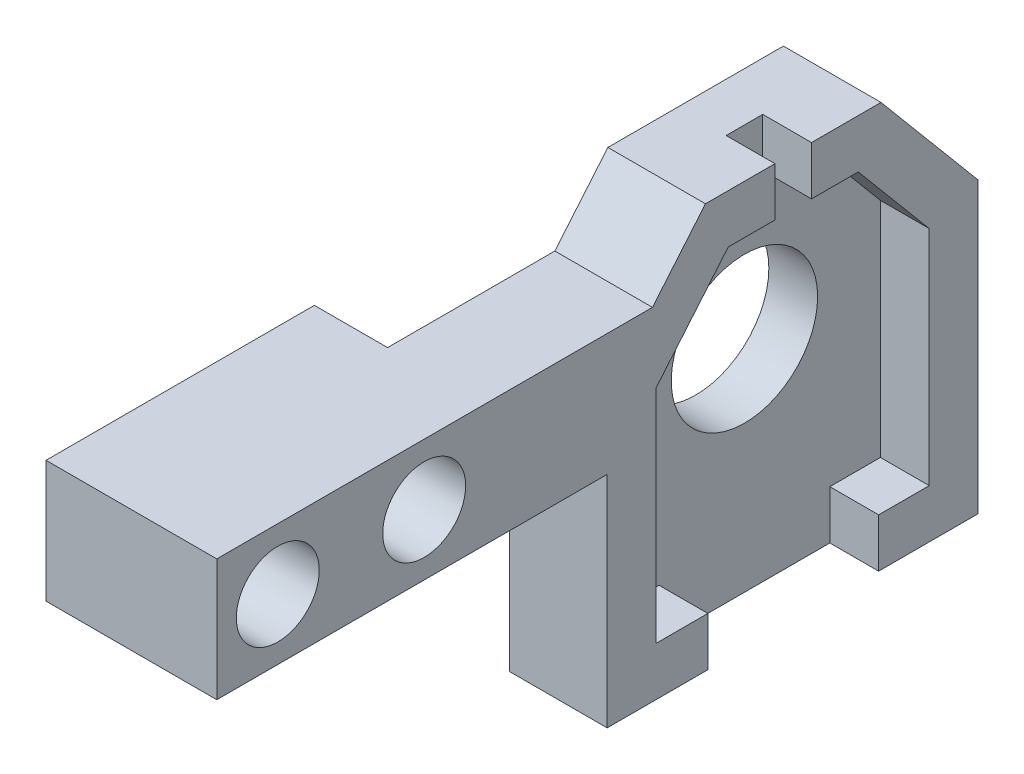
ISO-10303-21;
HEADER;
FILE_DESCRIPTION(('STEP AP214'),'2;1');
FILE_NAME('part.step','',(''),(''),'','','');
FILE_SCHEMA(('AUTOMOTIVE_DESIGN { 1 0 10303 214 1 1 1 1 }'));
ENDSEC;
DATA;
#1=APPLICATION_CONTEXT('core data for automotive mechanical design processes');
#2=APPLICATION_PROTOCOL_DEFINITION('international standard','automotive_design',2000,#1);
#3=PRODUCT_CONTEXT('',#1,'mechanical');
#4=PRODUCT('Part','Part','',(#3));
#5=PRODUCT_RELATED_PRODUCT_CATEGORY('part','',(#4));
#6=PRODUCT_DEFINITION_FORMATION('','',#4);
#7=PRODUCT_DEFINITION_CONTEXT('part definition',#1,'design');
#8=PRODUCT_DEFINITION('design','',#6,#7);
#9=PRODUCT_DEFINITION_SHAPE('','',#8);
#10=(LENGTH_UNIT() NAMED_UNIT(*) SI_UNIT(.MILLI.,.METRE.));
#11=(NAMED_UNIT(*) PLANE_ANGLE_UNIT() SI_UNIT($,.RADIAN.));
#12=(NAMED_UNIT(*) SI_UNIT($,.STERADIAN.) SOLID_ANGLE_UNIT());
#13=UNCERTAINTY_MEASURE_WITH_UNIT(LENGTH_MEASURE(1.E-05),#10,'distance_accuracy_value','');
#14=(GEOMETRIC_REPRESENTATION_CONTEXT(3) GLOBAL_UNCERTAINTY_ASSIGNED_CONTEXT((#13)) GLOBAL_UNIT_ASSIGNED_CONTEXT((#10,
#11,#12)) REPRESENTATION_CONTEXT('',''));
#15=CARTESIAN_POINT('',(0.,0.,0.));
#16=DIRECTION('',(0.,0.,1.));
#17=DIRECTION('',(1.,0.,0.));
#18=AXIS2_PLACEMENT_3D('',#15,#16,#17);
#19=CARTESIAN_POINT('',(0.,0.,0.));
#20=DIRECTION('',(-1.,0.,0.));
#21=DIRECTION('',(0.,0.,1.));
#22=AXIS2_PLACEMENT_3D('',#19,#20,#21);
#23=PLANE('',#22);
#24=CARTESIAN_POINT('',(0.,1.90865976235804,0.482116569244563));
#25=DIRECTION('',(1.,0.,0.));
#26=DIRECTION('',(0.,0.,-1.));
#27=AXIS2_PLACEMENT_3D('',#24,#25,#26);
#28=CIRCLE('',#27,3.);
#29=CARTESIAN_POINT('',(0.,1.90865976235804,-2.51788343075544));
#30=VERTEX_POINT('',#29);
#31=EDGE_CURVE('E228',#30,#30,#28,.T.);
#32=ORIENTED_EDGE('',*,*,#31,.F.);
#33=EDGE_LOOP('',(#32));
#34=FACE_BOUND('',#33,.T.);
#35=DIRECTION('',(0.,1.,0.));
#36=VECTOR('',#35,1.);
#37=CARTESIAN_POINT('',(0.,7.49865976235804,1.23211656924456));
#38=LINE('',#37,#36);
#39=CARTESIAN_POINT('',(0.,7.49865976235804,1.23211656924456));
#40=VERTEX_POINT('',#39);
#41=CARTESIAN_POINT('',(0.,9.49865976235804,1.23211656924456));
#42=VERTEX_POINT('',#41);
#43=EDGE_CURVE('E65',#40,#42,#38,.T.);
#44=ORIENTED_EDGE('',*,*,#43,.F.);
#45=DIRECTION('',(0.,0.,-1.));
#46=VECTOR('',#45,1.);
#47=CARTESIAN_POINT('',(0.,7.49865976235804,3.14728681258254));
#48=LINE('',#47,#46);
#49=CARTESIAN_POINT('',(0.,7.49865976235804,3.14728681258254));
#50=VERTEX_POINT('',#49);
#51=EDGE_CURVE('E403',#50,#40,#48,.T.);
#52=ORIENTED_EDGE('',*,*,#51,.F.);
#53=DIRECTION('',(0.,0.766044443118982,-0.642787609686534));
#54=VECTOR('',#53,1.);
#55=CARTESIAN_POINT('',(0.,3.96865976235804,6.1093085106383));
#56=LINE('',#55,#54);
#57=CARTESIAN_POINT('',(0.,3.96865976235804,6.1093085106383));
#58=VERTEX_POINT('',#57);
#59=EDGE_CURVE('E399',#58,#50,#56,.T.);
#60=ORIENTED_EDGE('',*,*,#59,.F.);
#61=DIRECTION('',(0.,1.,0.));
#62=VECTOR('',#61,1.);
#63=CARTESIAN_POINT('',(0.,3.96865976235804,6.1093085106383));
#64=LINE('',#63,#62);
#65=CARTESIAN_POINT('',(0.,-5.09134023764196,6.1093085106383));
#66=VERTEX_POINT('',#65);
#67=EDGE_CURVE('E394',#66,#58,#64,.T.);
#68=ORIENTED_EDGE('',*,*,#67,.F.);
#69=DIRECTION('',(0.,0.,1.));
#70=VECTOR('',#69,1.);
#71=CARTESIAN_POINT('',(0.,-5.09134023764196,6.1093085106383));
#72=LINE('',#71,#70);
#73=CARTESIAN_POINT('',(0.,-5.09134023764196,3.98211656924456));
#74=VERTEX_POINT('',#73);
#75=EDGE_CURVE('E390',#74,#66,#72,.T.);
#76=ORIENTED_EDGE('',*,*,#75,.F.);
#77=DIRECTION('',(0.,1.,0.));
#78=VECTOR('',#77,1.);
#79=CARTESIAN_POINT('',(0.,-5.09134023764196,3.98211656924456));
#80=LINE('',#79,#78);
#81=CARTESIAN_POINT('',(0.,-7.09134023764196,3.98211656924456));
#82=VERTEX_POINT('',#81);
#83=EDGE_CURVE('E408',#82,#74,#80,.T.);
#84=ORIENTED_EDGE('',*,*,#83,.F.);
#85=DIRECTION('',(0.,0.,-1.));
#86=VECTOR('',#85,1.);
#87=CARTESIAN_POINT('',(0.,-7.09134023764196,-7.0906914893617));
#88=LINE('',#87,#86);
#89=CARTESIAN_POINT('',(0.,-7.09134023764196,-3.01788343075544));
#90=VERTEX_POINT('',#89);
#91=EDGE_CURVE('E248',#82,#90,#88,.T.);
#92=ORIENTED_EDGE('',*,*,#91,.T.);
#93=DIRECTION('',(0.,-1.,0.));
#94=VECTOR('',#93,1.);
#95=CARTESIAN_POINT('',(0.,-5.09134023764196,-3.01788343075544));
#96=LINE('',#95,#94);
#97=CARTESIAN_POINT('',(0.,-5.09134023764196,-3.01788343075544));
#98=VERTEX_POINT('',#97);
#99=EDGE_CURVE('E311',#98,#90,#96,.T.);
#100=ORIENTED_EDGE('',*,*,#99,.F.);
#101=DIRECTION('',(0.,0.,1.));
#102=VECTOR('',#101,1.);
#103=CARTESIAN_POINT('',(0.,-5.09134023764196,-3.01788343075544));
#104=LINE('',#103,#102);
#105=CARTESIAN_POINT('',(0.,-5.09134023764196,-5.0906914893617));
#106=VERTEX_POINT('',#105);
#107=EDGE_CURVE('E307',#106,#98,#104,.T.);
#108=ORIENTED_EDGE('',*,*,#107,.F.);
#109=DIRECTION('',(0.,-1.,0.));
#110=VECTOR('',#109,1.);
#111=CARTESIAN_POINT('',(0.,4.03347195004924,-5.0906914893617));
#112=LINE('',#111,#110);
#113=CARTESIAN_POINT('',(0.,4.03347195004924,-5.0906914893617));
#114=VERTEX_POINT('',#113);
#115=EDGE_CURVE('E303',#114,#106,#112,.T.);
#116=ORIENTED_EDGE('',*,*,#115,.F.);
#117=DIRECTION('',(0.,-0.766044443118981,-0.642787609686535));
#118=VECTOR('',#117,1.);
#119=CARTESIAN_POINT('',(0.,4.03347195004924,-5.0906914893617));
#120=LINE('',#119,#118);
#121=CARTESIAN_POINT('',(0.,7.49865976235804,-2.18305367409341));
#122=VERTEX_POINT('',#121);
#123=EDGE_CURVE('E298',#122,#114,#120,.T.);
#124=ORIENTED_EDGE('',*,*,#123,.F.);
#125=DIRECTION('',(0.,0.,-1.));
#126=VECTOR('',#125,1.);
#127=CARTESIAN_POINT('',(0.,7.49865976235804,-0.267883430755437));
#128=LINE('',#127,#126);
#129=CARTESIAN_POINT('',(0.,7.49865976235804,-0.267883430755437));
#130=VERTEX_POINT('',#129);
#131=EDGE_CURVE('E294',#130,#122,#128,.T.);
#132=ORIENTED_EDGE('',*,*,#131,.F.);
#133=DIRECTION('',(0.,-1.,0.));
#134=VECTOR('',#133,1.);
#135=CARTESIAN_POINT('',(0.,7.49865976235804,-0.267883430755437));
#136=LINE('',#135,#134);
#137=CARTESIAN_POINT('',(0.,9.49865976235804,-0.267883430755437));
#138=VERTEX_POINT('',#137);
#139=EDGE_CURVE('E315',#138,#130,#136,.T.);
#140=ORIENTED_EDGE('',*,*,#139,.F.);
#141=DIRECTION('',(0.,0.,1.));
#142=VECTOR('',#141,1.);
#143=CARTESIAN_POINT('',(0.,9.49865976235804,4.07990212889255));
#144=LINE('',#143,#142);
#145=EDGE_CURVE('E251',#138,#42,#144,.T.);
#146=ORIENTED_EDGE('',*,*,#145,.T.);
#147=EDGE_LOOP('',(#44,#52,#60,#68,#76,#84,#92,#100,#108,#116,#124,#132,#140,#146));
#148=FACE_BOUND('',#147,.T.);
#149=ADVANCED_FACE('F39',(#34,#148),#23,.F.);
#150=CARTESIAN_POINT('',(-2.,-7.09134023764196,-7.0906914893617));
#151=DIRECTION('',(0.,-1.,0.));
#152=DIRECTION('',(0.,0.,-1.));
#153=AXIS2_PLACEMENT_3D('',#150,#151,#152);
#154=PLANE('',#153);
#155=ORIENTED_EDGE('',*,*,#91,.F.);
#156=DIRECTION('',(-1.,0.,0.));
#157=VECTOR('',#156,1.);
#158=CARTESIAN_POINT('',(2.,-7.09134023764196,3.98211656924456));
#159=LINE('',#158,#157);
#160=CARTESIAN_POINT('',(2.,-7.09134023764196,3.98211656924456));
#161=VERTEX_POINT('',#160);
#162=EDGE_CURVE('E416',#161,#82,#159,.T.);
#163=ORIENTED_EDGE('',*,*,#162,.F.);
#164=DIRECTION('',(0.,0.,-1.));
#165=VECTOR('',#164,1.);
#166=CARTESIAN_POINT('',(2.,-7.09134023764196,8.1093085106383));
#167=LINE('',#166,#165);
#168=CARTESIAN_POINT('',(2.,-7.09134023764196,8.1093085106383));
#169=VERTEX_POINT('',#168);
#170=EDGE_CURVE('E378',#169,#161,#167,.T.);
#171=ORIENTED_EDGE('',*,*,#170,.F.);
#172=DIRECTION('',(1.,0.,0.));
#173=VECTOR('',#172,1.);
#174=CARTESIAN_POINT('',(-2.,-7.09134023764196,8.1093085106383));
#175=LINE('',#174,#173);
#176=CARTESIAN_POINT('',(-2.,-7.09134023764196,8.1093085106383));
#177=VERTEX_POINT('',#176);
#178=EDGE_CURVE('E11',#177,#169,#175,.T.);
#179=ORIENTED_EDGE('',*,*,#178,.F.);
#180=DIRECTION('',(0.,0.,-1.));
#181=VECTOR('',#180,1.);
#182=CARTESIAN_POINT('',(-2.,-7.09134023764196,-7.0906914893617));
#183=LINE('',#182,#181);
#184=CARTESIAN_POINT('',(-2.,-7.09134023764196,-7.0906914893617));
#185=VERTEX_POINT('',#184);
#186=EDGE_CURVE('E236',#177,#185,#183,.T.);
#187=ORIENTED_EDGE('',*,*,#186,.T.);
#188=DIRECTION('',(1.,0.,0.));
#189=VECTOR('',#188,1.);
#190=CARTESIAN_POINT('',(-2.,-7.09134023764196,-7.0906914893617));
#191=LINE('',#190,#189);
#192=CARTESIAN_POINT('',(2.,-7.09134023764196,-7.0906914893617));
#193=VERTEX_POINT('',#192);
#194=EDGE_CURVE('E43',#185,#193,#191,.T.);
#195=ORIENTED_EDGE('',*,*,#194,.T.);
#196=DIRECTION('',(0.,0.,-1.));
#197=VECTOR('',#196,1.);
#198=CARTESIAN_POINT('',(2.,-7.09134023764196,-3.01788343075544));
#199=LINE('',#198,#197);
#200=CARTESIAN_POINT('',(2.,-7.09134023764196,-3.01788343075544));
#201=VERTEX_POINT('',#200);
#202=EDGE_CURVE('E279',#201,#193,#199,.T.);
#203=ORIENTED_EDGE('',*,*,#202,.F.);
#204=DIRECTION('',(-1.,0.,0.));
#205=VECTOR('',#204,1.);
#206=CARTESIAN_POINT('',(2.,-7.09134023764196,-3.01788343075544));
#207=LINE('',#206,#205);
#208=EDGE_CURVE('E327',#201,#90,#207,.T.);
#209=ORIENTED_EDGE('',*,*,#208,.T.);
#210=EDGE_LOOP('',(#155,#163,#171,#179,#187,#195,#203,#209));
#211=FACE_BOUND('',#210,.T.);
#212=ADVANCED_FACE('F41',(#211),#154,.T.);
#213=CARTESIAN_POINT('',(-2.,-7.09134023764196,8.1093085106383));
#214=DIRECTION('',(0.,0.,1.));
#215=DIRECTION('',(0.,-1.,0.));
#216=AXIS2_PLACEMENT_3D('',#213,#214,#215);
#217=PLANE('',#216);
#218=DIRECTION('',(1.,0.,0.));
#219=VECTOR('',#218,1.);
#220=CARTESIAN_POINT('',(-5.,1.90865976235804,8.1093085106383));
#221=LINE('',#220,#219);
#222=CARTESIAN_POINT('',(-2.,1.90865976235804,8.1093085106383));
#223=VERTEX_POINT('',#222);
#224=CARTESIAN_POINT('',(2.,1.90865976235804,8.1093085106383));
#225=VERTEX_POINT('',#224);
#226=EDGE_CURVE('E211',#223,#225,#221,.T.);
#227=ORIENTED_EDGE('',*,*,#226,.F.);
#228=DIRECTION('',(0.,-1.,0.));
#229=VECTOR('',#228,1.);
#230=CARTESIAN_POINT('',(-2.,-7.09134023764196,8.1093085106383));
#231=LINE('',#230,#229);
#232=EDGE_CURVE('E224',#223,#177,#231,.T.);
#233=ORIENTED_EDGE('',*,*,#232,.T.);
#234=ORIENTED_EDGE('',*,*,#178,.T.);
#235=DIRECTION('',(0.,-1.,0.));
#236=VECTOR('',#235,1.);
#237=CARTESIAN_POINT('',(2.,4.69660023089044,8.1093085106383));
#238=LINE('',#237,#236);
#239=EDGE_CURVE('E226',#225,#169,#238,.T.);
#240=ORIENTED_EDGE('',*,*,#239,.F.);
#241=EDGE_LOOP('',(#227,#233,#234,#240));
#242=FACE_BOUND('',#241,.T.);
#243=ADVANCED_FACE('F223',(#242),#217,.T.);
#244=CARTESIAN_POINT('',(-2.,4.69660023089044,8.1093085106383));
#245=DIRECTION('',(0.,0.642787609686534,0.766044443118982));
#246=DIRECTION('',(0.,-0.766044443118982,0.642787609686534));
#247=AXIS2_PLACEMENT_3D('',#244,#245,#246);
#248=PLANE('',#247);
#249=DIRECTION('',(1.,0.,0.));
#250=VECTOR('',#249,1.);
#251=CARTESIAN_POINT('',(-5.,6.90865976235804,6.25317017364167));
#252=LINE('',#251,#250);
#253=CARTESIAN_POINT('',(-2.,6.90865976235804,6.25317017364167));
#254=VERTEX_POINT('',#253);
#255=CARTESIAN_POINT('',(2.,6.90865976235804,6.25317017364167));
#256=VERTEX_POINT('',#255);
#257=EDGE_CURVE('E368',#254,#256,#252,.T.);
#258=ORIENTED_EDGE('',*,*,#257,.T.);
#259=DIRECTION('',(0.,-0.766044443118982,0.642787609686534));
#260=VECTOR('',#259,1.);
#261=CARTESIAN_POINT('',(2.,4.69660023089044,8.1093085106383));
#262=LINE('',#261,#260);
#263=CARTESIAN_POINT('',(2.,9.49865976235804,4.07990212889255));
#264=VERTEX_POINT('',#263);
#265=EDGE_CURVE('E370',#264,#256,#262,.T.);
#266=ORIENTED_EDGE('',*,*,#265,.F.);
#267=DIRECTION('',(1.,0.,0.));
#268=VECTOR('',#267,1.);
#269=CARTESIAN_POINT('',(-2.,9.49865976235804,4.07990212889255));
#270=LINE('',#269,#268);
#271=CARTESIAN_POINT('',(-2.,9.49865976235804,4.07990212889255));
#272=VERTEX_POINT('',#271);
#273=EDGE_CURVE('E49',#272,#264,#270,.T.);
#274=ORIENTED_EDGE('',*,*,#273,.F.);
#275=DIRECTION('',(0.,-0.766044443118982,0.642787609686534));
#276=VECTOR('',#275,1.);
#277=CARTESIAN_POINT('',(-2.,4.69660023089044,8.1093085106383));
#278=LINE('',#277,#276);
#279=EDGE_CURVE('E238',#272,#254,#278,.T.);
#280=ORIENTED_EDGE('',*,*,#279,.T.);
#281=EDGE_LOOP('',(#258,#266,#274,#280));
#282=FACE_BOUND('',#281,.T.);
#283=ADVANCED_FACE('F366',(#282),#248,.T.);
#284=CARTESIAN_POINT('',(-2.,9.49865976235804,4.07990212889255));
#285=DIRECTION('',(0.,1.,0.));
#286=DIRECTION('',(0.,0.,1.));
#287=AXIS2_PLACEMENT_3D('',#284,#285,#286);
#288=PLANE('',#287);
#289=ORIENTED_EDGE('',*,*,#145,.F.);
#290=DIRECTION('',(-1.,0.,0.));
#291=VECTOR('',#290,1.);
#292=CARTESIAN_POINT('',(2.,9.49865976235804,-0.267883430755437));
#293=LINE('',#292,#291);
#294=CARTESIAN_POINT('',(2.,9.49865976235804,-0.267883430755437));
#295=VERTEX_POINT('',#294);
#296=EDGE_CURVE('E323',#295,#138,#293,.T.);
#297=ORIENTED_EDGE('',*,*,#296,.F.);
#298=DIRECTION('',(0.,0.,1.));
#299=VECTOR('',#298,1.);
#300=CARTESIAN_POINT('',(2.,9.49865976235804,-0.267883430755437));
#301=LINE('',#300,#299);
#302=CARTESIAN_POINT('',(2.,9.49865976235804,-3.11566899040342));
#303=VERTEX_POINT('',#302);
#304=EDGE_CURVE('E284',#303,#295,#301,.T.);
#305=ORIENTED_EDGE('',*,*,#304,.F.);
#306=DIRECTION('',(1.,0.,0.));
#307=VECTOR('',#306,1.);
#308=CARTESIAN_POINT('',(-2.,9.49865976235804,-3.11566899040342));
#309=LINE('',#308,#307);
#310=CARTESIAN_POINT('',(-2.,9.49865976235804,-3.11566899040342));
#311=VERTEX_POINT('',#310);
#312=EDGE_CURVE('E257',#311,#303,#309,.T.);
#313=ORIENTED_EDGE('',*,*,#312,.F.);
#314=DIRECTION('',(0.,0.,1.));
#315=VECTOR('',#314,1.);
#316=CARTESIAN_POINT('',(-2.,9.49865976235804,4.07990212889255));
#317=LINE('',#316,#315);
#318=EDGE_CURVE('E244',#311,#272,#317,.T.);
#319=ORIENTED_EDGE('',*,*,#318,.T.);
#320=ORIENTED_EDGE('',*,*,#273,.T.);
#321=DIRECTION('',(0.,0.,1.));
#322=VECTOR('',#321,1.);
#323=CARTESIAN_POINT('',(2.,9.49865976235804,4.07990212889255));
#324=LINE('',#323,#322);
#325=CARTESIAN_POINT('',(2.,9.49865976235804,1.23211656924456));
#326=VERTEX_POINT('',#325);
#327=EDGE_CURVE('E374',#326,#264,#324,.T.);
#328=ORIENTED_EDGE('',*,*,#327,.F.);
#329=DIRECTION('',(-1.,0.,0.));
#330=VECTOR('',#329,1.);
#331=CARTESIAN_POINT('',(2.,9.49865976235804,1.23211656924456));
#332=LINE('',#331,#330);
#333=EDGE_CURVE('E420',#326,#42,#332,.T.);
#334=ORIENTED_EDGE('',*,*,#333,.T.);
#335=EDGE_LOOP('',(#289,#297,#305,#313,#319,#320,#328,#334));
#336=FACE_BOUND('',#335,.T.);
#337=ADVANCED_FACE('F357',(#336),#288,.T.);
#338=CARTESIAN_POINT('',(-2.,9.49865976235804,-3.11566899040342));
#339=DIRECTION('',(0.,0.642787609686535,-0.766044443118981));
#340=DIRECTION('',(0.,0.766044443118982,0.642787609686535));
#341=AXIS2_PLACEMENT_3D('',#338,#339,#340);
#342=PLANE('',#341);
#343=ORIENTED_EDGE('',*,*,#312,.T.);
#344=DIRECTION('',(0.,0.766044443118982,0.642787609686535));
#345=VECTOR('',#344,1.);
#346=CARTESIAN_POINT('',(2.,9.49865976235804,-3.11566899040342));
#347=LINE('',#346,#345);
#348=CARTESIAN_POINT('',(2.,4.76141241858164,-7.0906914893617));
#349=VERTEX_POINT('',#348);
#350=EDGE_CURVE('E276',#349,#303,#347,.T.);
#351=ORIENTED_EDGE('',*,*,#350,.F.);
#352=DIRECTION('',(1.,0.,0.));
#353=VECTOR('',#352,1.);
#354=CARTESIAN_POINT('',(-2.,4.76141241858164,-7.0906914893617));
#355=LINE('',#354,#353);
#356=CARTESIAN_POINT('',(-2.,4.76141241858164,-7.0906914893617));
#357=VERTEX_POINT('',#356);
#358=EDGE_CURVE('E242',#357,#349,#355,.T.);
#359=ORIENTED_EDGE('',*,*,#358,.F.);
#360=DIRECTION('',(0.,0.766044443118982,0.642787609686535));
#361=VECTOR('',#360,1.);
#362=CARTESIAN_POINT('',(-2.,9.49865976235804,-3.11566899040342));
#363=LINE('',#362,#361);
#364=EDGE_CURVE('E350',#357,#311,#363,.T.);
#365=ORIENTED_EDGE('',*,*,#364,.T.);
#366=EDGE_LOOP('',(#343,#351,#359,#365));
#367=FACE_BOUND('',#366,.T.);
#368=ADVANCED_FACE('F282',(#367),#342,.T.);
#369=CARTESIAN_POINT('',(-2.,4.76141241858164,-7.0906914893617));
#370=DIRECTION('',(0.,0.,-1.));
#371=DIRECTION('',(0.,1.,0.));
#372=AXIS2_PLACEMENT_3D('',#369,#370,#371);
#373=PLANE('',#372);
#374=ORIENTED_EDGE('',*,*,#358,.T.);
#375=DIRECTION('',(0.,1.,0.));
#376=VECTOR('',#375,1.);
#377=CARTESIAN_POINT('',(2.,4.76141241858164,-7.0906914893617));
#378=LINE('',#377,#376);
#379=EDGE_CURVE('E265',#193,#349,#378,.T.);
#380=ORIENTED_EDGE('',*,*,#379,.F.);
#381=ORIENTED_EDGE('',*,*,#194,.F.);
#382=DIRECTION('',(0.,1.,0.));
#383=VECTOR('',#382,1.);
#384=CARTESIAN_POINT('',(-2.,4.76141241858164,-7.0906914893617));
#385=LINE('',#384,#383);
#386=EDGE_CURVE('E266',#185,#357,#385,.T.);
#387=ORIENTED_EDGE('',*,*,#386,.T.);
#388=EDGE_LOOP('',(#374,#380,#381,#387));
#389=FACE_BOUND('',#388,.T.);
#390=ADVANCED_FACE('F264',(#389),#373,.T.);
#391=CARTESIAN_POINT('',(-2.,0.,0.));
#392=DIRECTION('',(-1.,0.,0.));
#393=DIRECTION('',(0.,0.,1.));
#394=AXIS2_PLACEMENT_3D('',#391,#392,#393);
#395=PLANE('',#394);
#396=ORIENTED_EDGE('',*,*,#232,.F.);
#397=DIRECTION('',(0.,0.,1.));
#398=VECTOR('',#397,1.);
#399=CARTESIAN_POINT('',(-2.,1.90865976235804,13.1093085106383));
#400=LINE('',#399,#398);
#401=CARTESIAN_POINT('',(-2.,1.90865976235804,13.1093085106383));
#402=VERTEX_POINT('',#401);
#403=EDGE_CURVE('E208',#223,#402,#400,.T.);
#404=ORIENTED_EDGE('',*,*,#403,.T.);
#405=DIRECTION('',(0.,1.,0.));
#406=VECTOR('',#405,1.);
#407=CARTESIAN_POINT('',(-2.,6.90865976235804,13.1093085106383));
#408=LINE('',#407,#406);
#409=CARTESIAN_POINT('',(-2.,6.90865976235804,13.1093085106383));
#410=VERTEX_POINT('',#409);
#411=EDGE_CURVE('E218',#402,#410,#408,.T.);
#412=ORIENTED_EDGE('',*,*,#411,.T.);
#413=DIRECTION('',(0.,0.,-1.));
#414=VECTOR('',#413,1.);
#415=CARTESIAN_POINT('',(-2.,6.90865976235804,8.1093085106383));
#416=LINE('',#415,#414);
#417=EDGE_CURVE('E362',#410,#254,#416,.T.);
#418=ORIENTED_EDGE('',*,*,#417,.T.);
#419=ORIENTED_EDGE('',*,*,#279,.F.);
#420=ORIENTED_EDGE('',*,*,#318,.F.);
#421=ORIENTED_EDGE('',*,*,#364,.F.);
#422=ORIENTED_EDGE('',*,*,#386,.F.);
#423=ORIENTED_EDGE('',*,*,#186,.F.);
#424=EDGE_LOOP('',(#396,#404,#412,#418,#419,#420,#421,#422,#423));
#425=FACE_BOUND('',#424,.T.);
#426=CARTESIAN_POINT('',(-2.,1.90865976235804,0.482116569244563));
#427=DIRECTION('',(1.,0.,0.));
#428=DIRECTION('',(0.,0.,-1.));
#429=AXIS2_PLACEMENT_3D('',#426,#427,#428);
#430=CIRCLE('',#429,3.);
#431=CARTESIAN_POINT('',(-2.,1.90865976235804,-2.51788343075544));
#432=VERTEX_POINT('',#431);
#433=EDGE_CURVE('E395',#432,#432,#430,.T.);
#434=ORIENTED_EDGE('',*,*,#433,.T.);
#435=EDGE_LOOP('',(#434));
#436=FACE_BOUND('',#435,.T.);
#437=ADVANCED_FACE('F232',(#425,#436),#395,.T.);
#438=CARTESIAN_POINT('',(2.,7.49865976235804,-0.267883430755437));
#439=DIRECTION('',(0.,1.,0.));
#440=DIRECTION('',(0.,0.,1.));
#441=AXIS2_PLACEMENT_3D('',#438,#439,#440);
#442=PLANE('',#441);
#443=ORIENTED_EDGE('',*,*,#131,.T.);
#444=DIRECTION('',(-1.,0.,0.));
#445=VECTOR('',#444,1.);
#446=CARTESIAN_POINT('',(2.,7.49865976235804,-2.18305367409341));
#447=LINE('',#446,#445);
#448=CARTESIAN_POINT('',(2.,7.49865976235804,-2.18305367409341));
#449=VERTEX_POINT('',#448);
#450=EDGE_CURVE('E252',#449,#122,#447,.T.);
#451=ORIENTED_EDGE('',*,*,#450,.F.);
#452=DIRECTION('',(0.,0.,-1.));
#453=VECTOR('',#452,1.);
#454=CARTESIAN_POINT('',(2.,7.49865976235804,-0.267883430755437));
#455=LINE('',#454,#453);
#456=CARTESIAN_POINT('',(2.,7.49865976235804,-0.267883430755437));
#457=VERTEX_POINT('',#456);
#458=EDGE_CURVE('E319',#457,#449,#455,.T.);
#459=ORIENTED_EDGE('',*,*,#458,.F.);
#460=DIRECTION('',(-1.,0.,0.));
#461=VECTOR('',#460,1.);
#462=CARTESIAN_POINT('',(2.,7.49865976235804,-0.267883430755437));
#463=LINE('',#462,#461);
#464=EDGE_CURVE('E293',#457,#130,#463,.T.);
#465=ORIENTED_EDGE('',*,*,#464,.T.);
#466=EDGE_LOOP('',(#443,#451,#459,#465));
#467=FACE_BOUND('',#466,.T.);
#468=ADVANCED_FACE('F524',(#467),#442,.F.);
#469=CARTESIAN_POINT('',(2.,4.03347195004924,-5.0906914893617));
#470=DIRECTION('',(0.,0.642787609686535,-0.766044443118982));
#471=DIRECTION('',(0.,0.766044443118982,0.642787609686535));
#472=AXIS2_PLACEMENT_3D('',#469,#470,#471);
#473=PLANE('',#472);
#474=ORIENTED_EDGE('',*,*,#123,.T.);
#475=DIRECTION('',(-1.,0.,0.));
#476=VECTOR('',#475,1.);
#477=CARTESIAN_POINT('',(2.,4.03347195004924,-5.0906914893617));
#478=LINE('',#477,#476);
#479=CARTESIAN_POINT('',(2.,4.03347195004924,-5.0906914893617));
#480=VERTEX_POINT('',#479);
#481=EDGE_CURVE('E339',#480,#114,#478,.T.);
#482=ORIENTED_EDGE('',*,*,#481,.F.);
#483=DIRECTION('',(0.,-0.766044443118981,-0.642787609686535));
#484=VECTOR('',#483,1.);
#485=CARTESIAN_POINT('',(2.,4.03347195004924,-5.0906914893617));
#486=LINE('',#485,#484);
#487=EDGE_CURVE('E441',#449,#480,#486,.T.);
#488=ORIENTED_EDGE('',*,*,#487,.F.);
#489=ORIENTED_EDGE('',*,*,#450,.T.);
#490=EDGE_LOOP('',(#474,#482,#488,#489));
#491=FACE_BOUND('',#490,.T.);
#492=ADVANCED_FACE('F526',(#491),#473,.F.);
#493=CARTESIAN_POINT('',(2.,4.03347195004924,-5.0906914893617));
#494=DIRECTION('',(0.,0.,-1.));
#495=DIRECTION('',(0.,1.,0.));
#496=AXIS2_PLACEMENT_3D('',#493,#494,#495);
#497=PLANE('',#496);
#498=ORIENTED_EDGE('',*,*,#115,.T.);
#499=DIRECTION('',(-1.,0.,0.));
#500=VECTOR('',#499,1.);
#501=CARTESIAN_POINT('',(2.,-5.09134023764196,-5.0906914893617));
#502=LINE('',#501,#500);
#503=CARTESIAN_POINT('',(2.,-5.09134023764196,-5.0906914893617));
#504=VERTEX_POINT('',#503);
#505=EDGE_CURVE('E335',#504,#106,#502,.T.);
#506=ORIENTED_EDGE('',*,*,#505,.F.);
#507=DIRECTION('',(0.,-1.,0.));
#508=VECTOR('',#507,1.);
#509=CARTESIAN_POINT('',(2.,4.03347195004924,-5.0906914893617));
#510=LINE('',#509,#508);
#511=EDGE_CURVE('E444',#480,#504,#510,.T.);
#512=ORIENTED_EDGE('',*,*,#511,.F.);
#513=ORIENTED_EDGE('',*,*,#481,.T.);
#514=EDGE_LOOP('',(#498,#506,#512,#513));
#515=FACE_BOUND('',#514,.T.);
#516=ADVANCED_FACE('F530',(#515),#497,.F.);
#517=CARTESIAN_POINT('',(2.,-5.09134023764196,-3.01788343075544));
#518=DIRECTION('',(0.,-1.,0.));
#519=DIRECTION('',(0.,0.,-1.));
#520=AXIS2_PLACEMENT_3D('',#517,#518,#519);
#521=PLANE('',#520);
#522=ORIENTED_EDGE('',*,*,#107,.T.);
#523=DIRECTION('',(-1.,0.,0.));
#524=VECTOR('',#523,1.);
#525=CARTESIAN_POINT('',(2.,-5.09134023764196,-3.01788343075544));
#526=LINE('',#525,#524);
#527=CARTESIAN_POINT('',(2.,-5.09134023764196,-3.01788343075544));
#528=VERTEX_POINT('',#527);
#529=EDGE_CURVE('E331',#528,#98,#526,.T.);
#530=ORIENTED_EDGE('',*,*,#529,.F.);
#531=DIRECTION('',(0.,0.,1.));
#532=VECTOR('',#531,1.);
#533=CARTESIAN_POINT('',(2.,-5.09134023764196,-3.01788343075544));
#534=LINE('',#533,#532);
#535=EDGE_CURVE('E447',#504,#528,#534,.T.);
#536=ORIENTED_EDGE('',*,*,#535,.F.);
#537=ORIENTED_EDGE('',*,*,#505,.T.);
#538=EDGE_LOOP('',(#522,#530,#536,#537));
#539=FACE_BOUND('',#538,.T.);
#540=ADVANCED_FACE('F532',(#539),#521,.F.);
#541=CARTESIAN_POINT('',(2.,-5.09134023764196,-3.01788343075544));
#542=DIRECTION('',(0.,0.,-1.));
#543=DIRECTION('',(0.,1.,0.));
#544=AXIS2_PLACEMENT_3D('',#541,#542,#543);
#545=PLANE('',#544);
#546=ORIENTED_EDGE('',*,*,#99,.T.);
#547=ORIENTED_EDGE('',*,*,#208,.F.);
#548=DIRECTION('',(0.,-1.,0.));
#549=VECTOR('',#548,1.);
#550=CARTESIAN_POINT('',(2.,-5.09134023764196,-3.01788343075544));
#551=LINE('',#550,#549);
#552=EDGE_CURVE('E450',#528,#201,#551,.T.);
#553=ORIENTED_EDGE('',*,*,#552,.F.);
#554=ORIENTED_EDGE('',*,*,#529,.T.);
#555=EDGE_LOOP('',(#546,#547,#553,#554));
#556=FACE_BOUND('',#555,.T.);
#557=ADVANCED_FACE('F458',(#556),#545,.F.);
#558=CARTESIAN_POINT('',(2.,7.49865976235804,-0.267883430755437));
#559=DIRECTION('',(0.,0.,-1.));
#560=DIRECTION('',(-1.,0.,0.));
#561=AXIS2_PLACEMENT_3D('',#558,#559,#560);
#562=PLANE('',#561);
#563=ORIENTED_EDGE('',*,*,#139,.T.);
#564=ORIENTED_EDGE('',*,*,#464,.F.);
#565=DIRECTION('',(0.,-1.,0.));
#566=VECTOR('',#565,1.);
#567=CARTESIAN_POINT('',(2.,7.49865976235804,-0.267883430755437));
#568=LINE('',#567,#566);
#569=EDGE_CURVE('E287',#295,#457,#568,.T.);
#570=ORIENTED_EDGE('',*,*,#569,.F.);
#571=ORIENTED_EDGE('',*,*,#296,.T.);
#572=EDGE_LOOP('',(#563,#564,#570,#571));
#573=FACE_BOUND('',#572,.T.);
#574=ADVANCED_FACE('F518',(#573),#562,.F.);
#575=CARTESIAN_POINT('',(2.,0.,0.));
#576=DIRECTION('',(-1.,0.,0.));
#577=DIRECTION('',(0.,0.,1.));
#578=AXIS2_PLACEMENT_3D('',#575,#576,#577);
#579=PLANE('',#578);
#580=ORIENTED_EDGE('',*,*,#458,.T.);
#581=ORIENTED_EDGE('',*,*,#487,.T.);
#582=ORIENTED_EDGE('',*,*,#511,.T.);
#583=ORIENTED_EDGE('',*,*,#535,.T.);
#584=ORIENTED_EDGE('',*,*,#552,.T.);
#585=ORIENTED_EDGE('',*,*,#202,.T.);
#586=ORIENTED_EDGE('',*,*,#379,.T.);
#587=ORIENTED_EDGE('',*,*,#350,.T.);
#588=ORIENTED_EDGE('',*,*,#304,.T.);
#589=ORIENTED_EDGE('',*,*,#569,.T.);
#590=EDGE_LOOP('',(#580,#581,#582,#583,#584,#585,#586,#587,#588,#589));
#591=FACE_BOUND('',#590,.T.);
#592=ADVANCED_FACE('F275',(#591),#579,.F.);
#593=CARTESIAN_POINT('',(2.,-5.09134023764196,6.1093085106383));
#594=DIRECTION('',(0.,-1.,0.));
#595=DIRECTION('',(0.,0.,-1.));
#596=AXIS2_PLACEMENT_3D('',#593,#594,#595);
#597=PLANE('',#596);
#598=ORIENTED_EDGE('',*,*,#75,.T.);
#599=DIRECTION('',(-1.,0.,0.));
#600=VECTOR('',#599,1.);
#601=CARTESIAN_POINT('',(2.,-5.09134023764196,6.1093085106383));
#602=LINE('',#601,#600);
#603=CARTESIAN_POINT('',(2.,-5.09134023764196,6.1093085106383));
#604=VERTEX_POINT('',#603);
#605=EDGE_CURVE('E299',#604,#66,#602,.T.);
#606=ORIENTED_EDGE('',*,*,#605,.F.);
#607=DIRECTION('',(0.,0.,1.));
#608=VECTOR('',#607,1.);
#609=CARTESIAN_POINT('',(2.,-5.09134023764196,6.1093085106383));
#610=LINE('',#609,#608);
#611=CARTESIAN_POINT('',(2.,-5.09134023764196,3.98211656924456));
#612=VERTEX_POINT('',#611);
#613=EDGE_CURVE('E412',#612,#604,#610,.T.);
#614=ORIENTED_EDGE('',*,*,#613,.F.);
#615=DIRECTION('',(-1.,0.,0.));
#616=VECTOR('',#615,1.);
#617=CARTESIAN_POINT('',(2.,-5.09134023764196,3.98211656924456));
#618=LINE('',#617,#616);
#619=EDGE_CURVE('E389',#612,#74,#618,.T.);
#620=ORIENTED_EDGE('',*,*,#619,.T.);
#621=EDGE_LOOP('',(#598,#606,#614,#620));
#622=FACE_BOUND('',#621,.T.);
#623=ADVANCED_FACE('F538',(#622),#597,.F.);
#624=CARTESIAN_POINT('',(2.,3.96865976235804,6.1093085106383));
#625=DIRECTION('',(0.,0.,1.));
#626=DIRECTION('',(0.,-1.,0.));
#627=AXIS2_PLACEMENT_3D('',#624,#625,#626);
#628=PLANE('',#627);
#629=ORIENTED_EDGE('',*,*,#67,.T.);
#630=DIRECTION('',(-1.,0.,0.));
#631=VECTOR('',#630,1.);
#632=CARTESIAN_POINT('',(2.,3.96865976235804,6.1093085106383));
#633=LINE('',#632,#631);
#634=CARTESIAN_POINT('',(2.,3.96865976235804,6.1093085106383));
#635=VERTEX_POINT('',#634);
#636=EDGE_CURVE('E432',#635,#58,#633,.T.);
#637=ORIENTED_EDGE('',*,*,#636,.F.);
#638=DIRECTION('',(0.,1.,0.));
#639=VECTOR('',#638,1.);
#640=CARTESIAN_POINT('',(2.,3.96865976235804,6.1093085106383));
#641=LINE('',#640,#639);
#642=EDGE_CURVE('E500',#604,#635,#641,.T.);
#643=ORIENTED_EDGE('',*,*,#642,.F.);
#644=ORIENTED_EDGE('',*,*,#605,.T.);
#645=EDGE_LOOP('',(#629,#637,#643,#644));
#646=FACE_BOUND('',#645,.T.);
#647=ADVANCED_FACE('F543',(#646),#628,.F.);
#648=CARTESIAN_POINT('',(2.,3.96865976235804,6.1093085106383));
#649=DIRECTION('',(0.,0.642787609686534,0.766044443118982));
#650=DIRECTION('',(0.,-0.766044443118982,0.642787609686534));
#651=AXIS2_PLACEMENT_3D('',#648,#649,#650);
#652=PLANE('',#651);
#653=ORIENTED_EDGE('',*,*,#59,.T.);
#654=DIRECTION('',(-1.,0.,0.));
#655=VECTOR('',#654,1.);
#656=CARTESIAN_POINT('',(2.,7.49865976235804,3.14728681258254));
#657=LINE('',#656,#655);
#658=CARTESIAN_POINT('',(2.,7.49865976235804,3.14728681258254));
#659=VERTEX_POINT('',#658);
#660=EDGE_CURVE('E428',#659,#50,#657,.T.);
#661=ORIENTED_EDGE('',*,*,#660,.F.);
#662=DIRECTION('',(0.,0.766044443118982,-0.642787609686534));
#663=VECTOR('',#662,1.);
#664=CARTESIAN_POINT('',(2.,3.96865976235804,6.1093085106383));
#665=LINE('',#664,#663);
#666=EDGE_CURVE('E503',#635,#659,#665,.T.);
#667=ORIENTED_EDGE('',*,*,#666,.F.);
#668=ORIENTED_EDGE('',*,*,#636,.T.);
#669=EDGE_LOOP('',(#653,#661,#667,#668));
#670=FACE_BOUND('',#669,.T.);
#671=ADVANCED_FACE('F545',(#670),#652,.F.);
#672=CARTESIAN_POINT('',(2.,7.49865976235804,3.14728681258254));
#673=DIRECTION('',(0.,1.,0.));
#674=DIRECTION('',(0.,0.,1.));
#675=AXIS2_PLACEMENT_3D('',#672,#673,#674);
#676=PLANE('',#675);
#677=ORIENTED_EDGE('',*,*,#51,.T.);
#678=DIRECTION('',(-1.,0.,0.));
#679=VECTOR('',#678,1.);
#680=CARTESIAN_POINT('',(2.,7.49865976235804,1.23211656924456));
#681=LINE('',#680,#679);
#682=CARTESIAN_POINT('',(2.,7.49865976235804,1.23211656924456));
#683=VERTEX_POINT('',#682);
#684=EDGE_CURVE('E424',#683,#40,#681,.T.);
#685=ORIENTED_EDGE('',*,*,#684,.F.);
#686=DIRECTION('',(0.,0.,-1.));
#687=VECTOR('',#686,1.);
#688=CARTESIAN_POINT('',(2.,7.49865976235804,3.14728681258254));
#689=LINE('',#688,#687);
#690=EDGE_CURVE('E506',#659,#683,#689,.T.);
#691=ORIENTED_EDGE('',*,*,#690,.F.);
#692=ORIENTED_EDGE('',*,*,#660,.T.);
#693=EDGE_LOOP('',(#677,#685,#691,#692));
#694=FACE_BOUND('',#693,.T.);
#695=ADVANCED_FACE('F547',(#694),#676,.F.);
#696=CARTESIAN_POINT('',(2.,7.49865976235804,1.23211656924456));
#697=DIRECTION('',(0.,0.,1.));
#698=DIRECTION('',(1.,0.,0.));
#699=AXIS2_PLACEMENT_3D('',#696,#697,#698);
#700=PLANE('',#699);
#701=ORIENTED_EDGE('',*,*,#43,.T.);
#702=ORIENTED_EDGE('',*,*,#333,.F.);
#703=DIRECTION('',(0.,1.,0.));
#704=VECTOR('',#703,1.);
#705=CARTESIAN_POINT('',(2.,7.49865976235804,1.23211656924456));
#706=LINE('',#705,#704);
#707=EDGE_CURVE('E380',#683,#326,#706,.T.);
#708=ORIENTED_EDGE('',*,*,#707,.F.);
#709=ORIENTED_EDGE('',*,*,#684,.T.);
#710=EDGE_LOOP('',(#701,#702,#708,#709));
#711=FACE_BOUND('',#710,.T.);
#712=ADVANCED_FACE('F514',(#711),#700,.F.);
#713=CARTESIAN_POINT('',(2.,-5.09134023764196,3.98211656924456));
#714=DIRECTION('',(0.,0.,1.));
#715=DIRECTION('',(1.,0.,0.));
#716=AXIS2_PLACEMENT_3D('',#713,#714,#715);
#717=PLANE('',#716);
#718=ORIENTED_EDGE('',*,*,#83,.T.);
#719=ORIENTED_EDGE('',*,*,#619,.F.);
#720=DIRECTION('',(0.,1.,0.));
#721=VECTOR('',#720,1.);
#722=CARTESIAN_POINT('',(2.,-5.09134023764196,3.98211656924456));
#723=LINE('',#722,#721);
#724=EDGE_CURVE('E386',#161,#612,#723,.T.);
#725=ORIENTED_EDGE('',*,*,#724,.F.);
#726=ORIENTED_EDGE('',*,*,#162,.T.);
#727=EDGE_LOOP('',(#718,#719,#725,#726));
#728=FACE_BOUND('',#727,.T.);
#729=ADVANCED_FACE('F534',(#728),#717,.F.);
#730=CARTESIAN_POINT('',(2.,0.,0.));
#731=DIRECTION('',(-1.,0.,0.));
#732=DIRECTION('',(0.,0.,1.));
#733=AXIS2_PLACEMENT_3D('',#730,#731,#732);
#734=PLANE('',#733);
#735=DIRECTION('',(0.,0.,-1.));
#736=VECTOR('',#735,1.);
#737=CARTESIAN_POINT('',(2.,1.90865976235804,15.4821165692446));
#738=LINE('',#737,#736);
#739=CARTESIAN_POINT('',(2.,1.90865976235804,24.1093085106383));
#740=VERTEX_POINT('',#739);
#741=EDGE_CURVE('E469',#740,#225,#738,.T.);
#742=ORIENTED_EDGE('',*,*,#741,.T.);
#743=ORIENTED_EDGE('',*,*,#239,.T.);
#744=ORIENTED_EDGE('',*,*,#170,.T.);
#745=ORIENTED_EDGE('',*,*,#724,.T.);
#746=ORIENTED_EDGE('',*,*,#613,.T.);
#747=ORIENTED_EDGE('',*,*,#642,.T.);
#748=ORIENTED_EDGE('',*,*,#666,.T.);
#749=ORIENTED_EDGE('',*,*,#690,.T.);
#750=ORIENTED_EDGE('',*,*,#707,.T.);
#751=ORIENTED_EDGE('',*,*,#327,.T.);
#752=ORIENTED_EDGE('',*,*,#265,.T.);
#753=DIRECTION('',(0.,0.,1.));
#754=VECTOR('',#753,1.);
#755=CARTESIAN_POINT('',(2.,6.90865976235804,24.1093085106383));
#756=LINE('',#755,#754);
#757=CARTESIAN_POINT('',(2.,6.90865976235804,24.1093085106383));
#758=VERTEX_POINT('',#757);
#759=EDGE_CURVE('E480',#256,#758,#756,.T.);
#760=ORIENTED_EDGE('',*,*,#759,.T.);
#761=DIRECTION('',(0.,-1.,0.));
#762=VECTOR('',#761,1.);
#763=CARTESIAN_POINT('',(2.,1.90865976235804,24.1093085106383));
#764=LINE('',#763,#762);
#765=EDGE_CURVE('E471',#758,#740,#764,.T.);
#766=ORIENTED_EDGE('',*,*,#765,.T.);
#767=EDGE_LOOP('',(#742,#743,#744,#745,#746,#747,#748,#749,#750,#751,#752,#760,#766));
#768=FACE_BOUND('',#767,.T.);
#769=CARTESIAN_POINT('',(2.,4.40865976235804,21.6093085106383));
#770=DIRECTION('',(1.,0.,0.));
#771=DIRECTION('',(0.,0.,-1.));
#772=AXIS2_PLACEMENT_3D('',#769,#770,#771);
#773=CIRCLE('',#772,1.7);
#774=CARTESIAN_POINT('',(2.,4.40865976235804,19.9093085106383));
#775=VERTEX_POINT('',#774);
#776=EDGE_CURVE('E751',#775,#775,#773,.T.);
#777=ORIENTED_EDGE('',*,*,#776,.F.);
#778=EDGE_LOOP('',(#777));
#779=FACE_BOUND('',#778,.T.);
#780=CARTESIAN_POINT('',(2.,4.40865976235804,15.6093085106383));
#781=DIRECTION('',(1.,0.,0.));
#782=DIRECTION('',(0.,0.,-1.));
#783=AXIS2_PLACEMENT_3D('',#780,#781,#782);
#784=CIRCLE('',#783,1.7);
#785=CARTESIAN_POINT('',(2.,4.40865976235804,13.9093085106383));
#786=VERTEX_POINT('',#785);
#787=EDGE_CURVE('E764',#786,#786,#784,.T.);
#788=ORIENTED_EDGE('',*,*,#787,.F.);
#789=EDGE_LOOP('',(#788));
#790=FACE_BOUND('',#789,.T.);
#791=ADVANCED_FACE('F464',(#768,#779,#790),#734,.F.);
#792=CARTESIAN_POINT('',(-2.,1.90865976235804,0.482116569244563));
#793=DIRECTION('',(1.,0.,0.));
#794=DIRECTION('',(0.,0.,-1.));
#795=AXIS2_PLACEMENT_3D('',#792,#793,#794);
#796=CYLINDRICAL_SURFACE('',#795,3.);
#797=ORIENTED_EDGE('',*,*,#433,.F.);
#798=EDGE_LOOP('',(#797));
#799=FACE_BOUND('',#798,.T.);
#800=ORIENTED_EDGE('',*,*,#31,.T.);
#801=EDGE_LOOP('',(#800));
#802=FACE_BOUND('',#801,.T.);
#803=ADVANCED_FACE('F637',(#799,#802),#796,.F.);
#804=CARTESIAN_POINT('',(-5.,1.90865976235804,15.4821165692446));
#805=DIRECTION('',(0.,-1.,0.));
#806=DIRECTION('',(0.,0.,-1.));
#807=AXIS2_PLACEMENT_3D('',#804,#805,#806);
#808=PLANE('',#807);
#809=DIRECTION('',(-1.,0.,0.));
#810=VECTOR('',#809,1.);
#811=CARTESIAN_POINT('',(-2.,1.90865976235804,13.1093085106383));
#812=LINE('',#811,#810);
#813=CARTESIAN_POINT('',(-5.,1.90865976235804,13.1093085106383));
#814=VERTEX_POINT('',#813);
#815=EDGE_CURVE('E57',#402,#814,#812,.T.);
#816=ORIENTED_EDGE('',*,*,#815,.F.);
#817=ORIENTED_EDGE('',*,*,#403,.F.);
#818=ORIENTED_EDGE('',*,*,#226,.T.);
#819=ORIENTED_EDGE('',*,*,#741,.F.);
#820=DIRECTION('',(1.,0.,0.));
#821=VECTOR('',#820,1.);
#822=CARTESIAN_POINT('',(-5.,1.90865976235804,24.1093085106383));
#823=LINE('',#822,#821);
#824=CARTESIAN_POINT('',(-5.,1.90865976235804,24.1093085106383));
#825=VERTEX_POINT('',#824);
#826=EDGE_CURVE('E229',#825,#740,#823,.T.);
#827=ORIENTED_EDGE('',*,*,#826,.F.);
#828=DIRECTION('',(0.,0.,-1.));
#829=VECTOR('',#828,1.);
#830=CARTESIAN_POINT('',(-5.,1.90865976235804,15.4821165692446));
#831=LINE('',#830,#829);
#832=EDGE_CURVE('E491',#825,#814,#831,.T.);
#833=ORIENTED_EDGE('',*,*,#832,.T.);
#834=EDGE_LOOP('',(#816,#817,#818,#819,#827,#833));
#835=FACE_BOUND('',#834,.T.);
#836=ADVANCED_FACE('F210',(#835),#808,.T.);
#837=CARTESIAN_POINT('',(-5.,1.90865976235804,24.1093085106383));
#838=DIRECTION('',(0.,0.,1.));
#839=DIRECTION('',(1.,0.,0.));
#840=AXIS2_PLACEMENT_3D('',#837,#838,#839);
#841=PLANE('',#840);
#842=ORIENTED_EDGE('',*,*,#765,.F.);
#843=DIRECTION('',(1.,0.,0.));
#844=VECTOR('',#843,1.);
#845=CARTESIAN_POINT('',(-5.,6.90865976235804,24.1093085106383));
#846=LINE('',#845,#844);
#847=CARTESIAN_POINT('',(-5.,6.90865976235804,24.1093085106383));
#848=VERTEX_POINT('',#847);
#849=EDGE_CURVE('E486',#848,#758,#846,.T.);
#850=ORIENTED_EDGE('',*,*,#849,.F.);
#851=DIRECTION('',(0.,-1.,0.));
#852=VECTOR('',#851,1.);
#853=CARTESIAN_POINT('',(-5.,1.90865976235804,24.1093085106383));
#854=LINE('',#853,#852);
#855=EDGE_CURVE('E478',#848,#825,#854,.T.);
#856=ORIENTED_EDGE('',*,*,#855,.T.);
#857=ORIENTED_EDGE('',*,*,#826,.T.);
#858=EDGE_LOOP('',(#842,#850,#856,#857));
#859=FACE_BOUND('',#858,.T.);
#860=ADVANCED_FACE('F656',(#859),#841,.T.);
#861=CARTESIAN_POINT('',(-5.,6.90865976235804,24.1093085106383));
#862=DIRECTION('',(0.,1.,0.));
#863=DIRECTION('',(0.,0.,1.));
#864=AXIS2_PLACEMENT_3D('',#861,#862,#863);
#865=PLANE('',#864);
#866=DIRECTION('',(-1.,0.,0.));
#867=VECTOR('',#866,1.);
#868=CARTESIAN_POINT('',(-2.,6.90865976235804,13.1093085106383));
#869=LINE('',#868,#867);
#870=CARTESIAN_POINT('',(-5.,6.90865976235804,13.1093085106383));
#871=VERTEX_POINT('',#870);
#872=EDGE_CURVE('E743',#410,#871,#869,.T.);
#873=ORIENTED_EDGE('',*,*,#872,.T.);
#874=DIRECTION('',(0.,0.,1.));
#875=VECTOR('',#874,1.);
#876=CARTESIAN_POINT('',(-5.,6.90865976235804,6.25317017364167));
#877=LINE('',#876,#875);
#878=EDGE_CURVE('E474',#871,#848,#877,.T.);
#879=ORIENTED_EDGE('',*,*,#878,.T.);
#880=ORIENTED_EDGE('',*,*,#849,.T.);
#881=ORIENTED_EDGE('',*,*,#759,.F.);
#882=ORIENTED_EDGE('',*,*,#257,.F.);
#883=ORIENTED_EDGE('',*,*,#417,.F.);
#884=EDGE_LOOP('',(#873,#879,#880,#881,#882,#883));
#885=FACE_BOUND('',#884,.T.);
#886=ADVANCED_FACE('F661',(#885),#865,.T.);
#887=CARTESIAN_POINT('',(-5.,0.,0.));
#888=DIRECTION('',(1.,0.,0.));
#889=DIRECTION('',(0.,0.,-1.));
#890=AXIS2_PLACEMENT_3D('',#887,#888,#889);
#891=PLANE('',#890);
#892=CARTESIAN_POINT('',(-5.,4.40865976235804,21.6093085106383));
#893=DIRECTION('',(1.,0.,0.));
#894=DIRECTION('',(0.,0.,-1.));
#895=AXIS2_PLACEMENT_3D('',#892,#893,#894);
#896=CIRCLE('',#895,1.7);
#897=CARTESIAN_POINT('',(-5.,4.40865976235804,19.9093085106383));
#898=VERTEX_POINT('',#897);
#899=EDGE_CURVE('E770',#898,#898,#896,.T.);
#900=ORIENTED_EDGE('',*,*,#899,.T.);
#901=EDGE_LOOP('',(#900));
#902=FACE_BOUND('',#901,.T.);
#903=CARTESIAN_POINT('',(-5.,4.40865976235804,15.6093085106383));
#904=DIRECTION('',(1.,0.,0.));
#905=DIRECTION('',(0.,0.,-1.));
#906=AXIS2_PLACEMENT_3D('',#903,#904,#905);
#907=CIRCLE('',#906,1.7);
#908=CARTESIAN_POINT('',(-5.,4.40865976235804,13.9093085106383));
#909=VERTEX_POINT('',#908);
#910=EDGE_CURVE('E761',#909,#909,#907,.T.);
#911=ORIENTED_EDGE('',*,*,#910,.T.);
#912=EDGE_LOOP('',(#911));
#913=FACE_BOUND('',#912,.T.);
#914=ORIENTED_EDGE('',*,*,#878,.F.);
#915=DIRECTION('',(0.,1.,0.));
#916=VECTOR('',#915,1.);
#917=CARTESIAN_POINT('',(-5.,6.90865976235804,13.1093085106383));
#918=LINE('',#917,#916);
#919=EDGE_CURVE('E219',#814,#871,#918,.T.);
#920=ORIENTED_EDGE('',*,*,#919,.F.);
#921=ORIENTED_EDGE('',*,*,#832,.F.);
#922=ORIENTED_EDGE('',*,*,#855,.F.);
#923=EDGE_LOOP('',(#914,#920,#921,#922));
#924=FACE_BOUND('',#923,.T.);
#925=ADVANCED_FACE('F676',(#902,#913,#924),#891,.F.);
#926=CARTESIAN_POINT('',(-5.,4.40865976235804,15.6093085106383));
#927=DIRECTION('',(1.,0.,0.));
#928=DIRECTION('',(0.,0.,-1.));
#929=AXIS2_PLACEMENT_3D('',#926,#927,#928);
#930=CYLINDRICAL_SURFACE('',#929,1.7);
#931=ORIENTED_EDGE('',*,*,#910,.F.);
#932=EDGE_LOOP('',(#931));
#933=FACE_BOUND('',#932,.T.);
#934=ORIENTED_EDGE('',*,*,#787,.T.);
#935=EDGE_LOOP('',(#934));
#936=FACE_BOUND('',#935,.T.);
#937=ADVANCED_FACE('F670',(#933,#936),#930,.F.);
#938=CARTESIAN_POINT('',(-5.,4.40865976235804,21.6093085106383));
#939=DIRECTION('',(1.,0.,0.));
#940=DIRECTION('',(0.,0.,-1.));
#941=AXIS2_PLACEMENT_3D('',#938,#939,#940);
#942=CYLINDRICAL_SURFACE('',#941,1.7);
#943=ORIENTED_EDGE('',*,*,#899,.F.);
#944=EDGE_LOOP('',(#943));
#945=FACE_BOUND('',#944,.T.);
#946=ORIENTED_EDGE('',*,*,#776,.T.);
#947=EDGE_LOOP('',(#946));
#948=FACE_BOUND('',#947,.T.);
#949=ADVANCED_FACE('F675',(#945,#948),#942,.F.);
#950=CARTESIAN_POINT('',(-2.,6.90865976235804,13.1093085106383));
#951=DIRECTION('',(0.,0.,1.));
#952=DIRECTION('',(1.,0.,0.));
#953=AXIS2_PLACEMENT_3D('',#950,#951,#952);
#954=PLANE('',#953);
#955=ORIENTED_EDGE('',*,*,#919,.T.);
#956=ORIENTED_EDGE('',*,*,#872,.F.);
#957=ORIENTED_EDGE('',*,*,#411,.F.);
#958=ORIENTED_EDGE('',*,*,#815,.T.);
#959=EDGE_LOOP('',(#955,#956,#957,#958));
#960=FACE_BOUND('',#959,.T.);
#961=ADVANCED_FACE('F688',(#960),#954,.F.);
#962=CLOSED_SHELL('',(#149,#212,#243,#283,#337,#368,#390,#437,#468,#492,#516,#540,#557,#574,
#592,#623,#647,#671,#695,#712,#729,#791,#803,#836,#860,#886,#925,#937,#949,#961));
#963=MANIFOLD_SOLID_BREP('B2',#962);
#964=ADVANCED_BREP_SHAPE_REPRESENTATION('',(#18,#963),#14);
#965=SHAPE_DEFINITION_REPRESENTATION(#9,#964);
ENDSEC;
END-ISO-10303-21;
